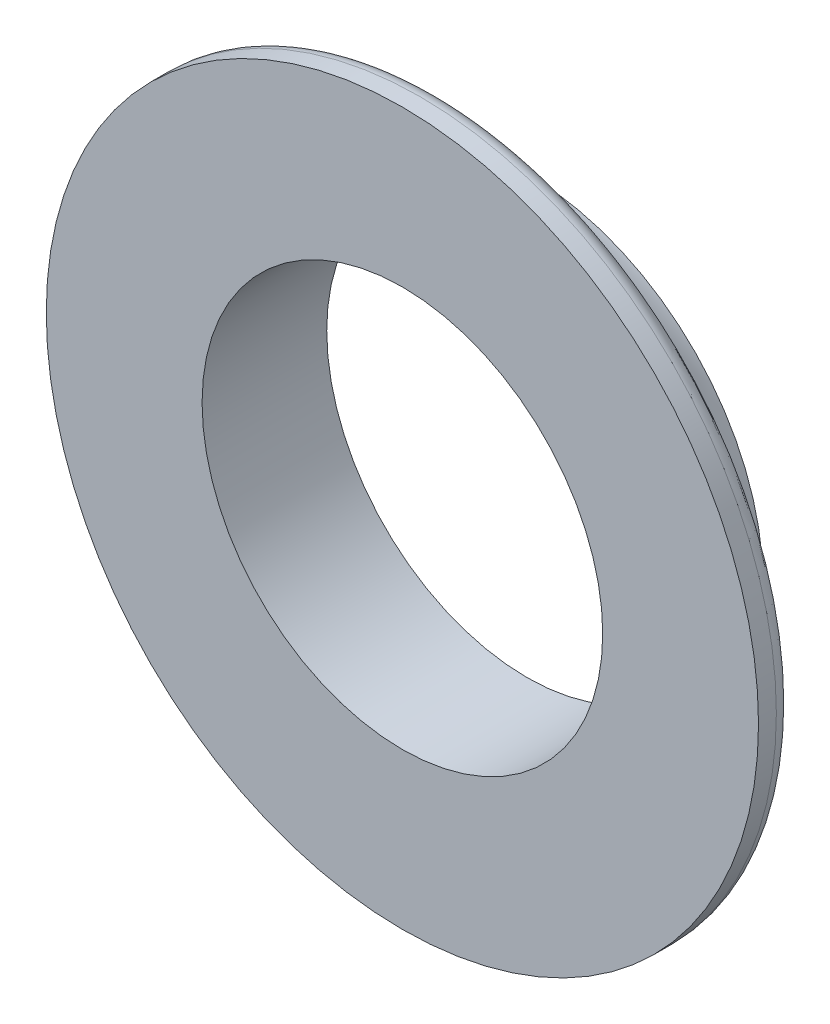
ISO-10303-21;
HEADER;
FILE_DESCRIPTION(('STEP AP214'),'2;1');
FILE_NAME('part.step','',(''),(''),'','','');
FILE_SCHEMA(('AUTOMOTIVE_DESIGN { 1 0 10303 214 1 1 1 1 }'));
ENDSEC;
DATA;
#1=APPLICATION_CONTEXT('core data for automotive mechanical design processes');
#2=APPLICATION_PROTOCOL_DEFINITION('international standard','automotive_design',2000,#1);
#3=PRODUCT_CONTEXT('',#1,'mechanical');
#4=PRODUCT('Part','Part','',(#3));
#5=PRODUCT_RELATED_PRODUCT_CATEGORY('part','',(#4));
#6=PRODUCT_DEFINITION_FORMATION('','',#4);
#7=PRODUCT_DEFINITION_CONTEXT('part definition',#1,'design');
#8=PRODUCT_DEFINITION('design','',#6,#7);
#9=PRODUCT_DEFINITION_SHAPE('','',#8);
#10=(LENGTH_UNIT() NAMED_UNIT(*) SI_UNIT(.MILLI.,.METRE.));
#11=(NAMED_UNIT(*) PLANE_ANGLE_UNIT() SI_UNIT($,.RADIAN.));
#12=(NAMED_UNIT(*) SI_UNIT($,.STERADIAN.) SOLID_ANGLE_UNIT());
#13=UNCERTAINTY_MEASURE_WITH_UNIT(LENGTH_MEASURE(1.E-05),#10,'distance_accuracy_value','');
#14=(GEOMETRIC_REPRESENTATION_CONTEXT(3) GLOBAL_UNCERTAINTY_ASSIGNED_CONTEXT((#13)) GLOBAL_UNIT_ASSIGNED_CONTEXT((#10,
#11,#12)) REPRESENTATION_CONTEXT('',''));
#15=CARTESIAN_POINT('',(0.,0.,0.));
#16=DIRECTION('',(0.,0.,1.));
#17=DIRECTION('',(1.,0.,0.));
#18=AXIS2_PLACEMENT_3D('',#15,#16,#17);
#19=CARTESIAN_POINT('',(0.,0.,7.));
#20=DIRECTION('',(0.,0.,-1.));
#21=DIRECTION('',(-1.,0.,0.));
#22=AXIS2_PLACEMENT_3D('',#19,#20,#21);
#23=CYLINDRICAL_SURFACE('',#22,11.25);
#24=CARTESIAN_POINT('',(0.,0.,0.));
#25=DIRECTION('',(0.,0.,1.));
#26=DIRECTION('',(1.,0.,0.));
#27=AXIS2_PLACEMENT_3D('',#24,#25,#26);
#28=CIRCLE('',#27,11.25);
#29=CARTESIAN_POINT('',(11.25,0.,0.));
#30=VERTEX_POINT('',#29);
#31=EDGE_CURVE('E46',#30,#30,#28,.T.);
#32=ORIENTED_EDGE('',*,*,#31,.F.);
#33=EDGE_LOOP('',(#32));
#34=FACE_BOUND('',#33,.T.);
#35=CARTESIAN_POINT('',(0.,0.,7.));
#36=DIRECTION('',(0.,0.,-1.));
#37=DIRECTION('',(-1.,0.,0.));
#38=AXIS2_PLACEMENT_3D('',#35,#36,#37);
#39=CIRCLE('',#38,11.25);
#40=CARTESIAN_POINT('',(-11.25,0.,7.));
#41=VERTEX_POINT('',#40);
#42=EDGE_CURVE('E54',#41,#41,#39,.T.);
#43=ORIENTED_EDGE('',*,*,#42,.F.);
#44=EDGE_LOOP('',(#43));
#45=FACE_BOUND('',#44,.T.);
#46=ADVANCED_FACE('F31',(#34,#45),#23,.F.);
#47=CARTESIAN_POINT('',(0.,0.,0.));
#48=DIRECTION('',(0.,0.,1.));
#49=DIRECTION('',(1.,0.,0.));
#50=AXIS2_PLACEMENT_3D('',#47,#48,#49);
#51=PLANE('',#50);
#52=CARTESIAN_POINT('',(0.,0.,0.));
#53=DIRECTION('',(0.,0.,1.));
#54=DIRECTION('',(1.,0.,0.));
#55=AXIS2_PLACEMENT_3D('',#52,#53,#54);
#56=CIRCLE('',#55,13.25);
#57=CARTESIAN_POINT('',(13.25,0.,0.));
#58=VERTEX_POINT('',#57);
#59=EDGE_CURVE('E42',#58,#58,#56,.T.);
#60=ORIENTED_EDGE('',*,*,#59,.F.);
#61=EDGE_LOOP('',(#60));
#62=FACE_BOUND('',#61,.T.);
#63=ORIENTED_EDGE('',*,*,#31,.T.);
#64=EDGE_LOOP('',(#63));
#65=FACE_BOUND('',#64,.T.);
#66=ADVANCED_FACE('F62',(#62,#65),#51,.F.);
#67=CARTESIAN_POINT('',(0.,0.,5.));
#68=DIRECTION('',(0.,0.,1.));
#69=DIRECTION('',(1.,0.,0.));
#70=AXIS2_PLACEMENT_3D('',#67,#68,#69);
#71=CYLINDRICAL_SURFACE('',#70,20.);
#72=CARTESIAN_POINT('',(0.,0.,5.99802954449648));
#73=DIRECTION('',(0.,0.,-1.));
#74=DIRECTION('',(-1.,0.,0.));
#75=AXIS2_PLACEMENT_3D('',#72,#73,#74);
#76=CIRCLE('',#75,20.);
#77=CARTESIAN_POINT('',(-20.,0.,5.99802954449648));
#78=VERTEX_POINT('',#77);
#79=EDGE_CURVE('E38',#78,#78,#76,.F.);
#80=ORIENTED_EDGE('',*,*,#79,.T.);
#81=EDGE_LOOP('',(#80));
#82=FACE_BOUND('',#81,.T.);
#83=CARTESIAN_POINT('',(0.,0.,7.));
#84=DIRECTION('',(0.,0.,1.));
#85=DIRECTION('',(1.,0.,0.));
#86=AXIS2_PLACEMENT_3D('',#83,#84,#85);
#87=CIRCLE('',#86,20.);
#88=CARTESIAN_POINT('',(20.,0.,7.));
#89=VERTEX_POINT('',#88);
#90=EDGE_CURVE('E51',#89,#89,#87,.T.);
#91=ORIENTED_EDGE('',*,*,#90,.F.);
#92=EDGE_LOOP('',(#91));
#93=FACE_BOUND('',#92,.T.);
#94=ADVANCED_FACE('F68',(#82,#93),#71,.T.);
#95=CARTESIAN_POINT('',(0.,0.,7.));
#96=DIRECTION('',(0.,0.,1.));
#97=DIRECTION('',(1.,0.,0.));
#98=AXIS2_PLACEMENT_3D('',#95,#96,#97);
#99=PLANE('',#98);
#100=ORIENTED_EDGE('',*,*,#42,.T.);
#101=EDGE_LOOP('',(#100));
#102=FACE_BOUND('',#101,.T.);
#103=ORIENTED_EDGE('',*,*,#90,.T.);
#104=EDGE_LOOP('',(#103));
#105=FACE_BOUND('',#104,.T.);
#106=ADVANCED_FACE('F58',(#102,#105),#99,.T.);
#107=CARTESIAN_POINT('',(0.,0.,-1.));
#108=DIRECTION('',(0.,0.,1.));
#109=DIRECTION('',(1.,0.,0.));
#110=AXIS2_PLACEMENT_3D('',#107,#108,#109);
#111=TOROIDAL_SURFACE('',#110,19.1660797830996,6.);
#112=CARTESIAN_POINT('',(0.,0.,4.99831103812946));
#113=DIRECTION('',(0.,0.,-1.));
#114=DIRECTION('',(-1.,0.,0.));
#115=AXIS2_PLACEMENT_3D('',#112,#113,#114);
#116=CIRCLE('',#115,19.0237256833002);
#117=CARTESIAN_POINT('',(-19.0237256833002,0.,4.99831103812946));
#118=VERTEX_POINT('',#117);
#119=EDGE_CURVE('E10',#118,#118,#116,.T.);
#120=ORIENTED_EDGE('',*,*,#119,.T.);
#121=EDGE_LOOP('',(#120));
#122=FACE_BOUND('',#121,.T.);
#123=ORIENTED_EDGE('',*,*,#59,.T.);
#124=EDGE_LOOP('',(#123));
#125=FACE_BOUND('',#124,.T.);
#126=ADVANCED_FACE('F75',(#122,#125),#111,.F.);
#127=CARTESIAN_POINT('',(0.,0.,5.99802954449648));
#128=DIRECTION('',(0.,0.,-1.));
#129=DIRECTION('',(-1.,0.,0.));
#130=AXIS2_PLACEMENT_3D('',#127,#128,#129);
#131=TOROIDAL_SURFACE('',#130,19.,1.);
#132=ORIENTED_EDGE('',*,*,#119,.F.);
#133=EDGE_LOOP('',(#132));
#134=FACE_BOUND('',#133,.T.);
#135=ORIENTED_EDGE('',*,*,#79,.F.);
#136=EDGE_LOOP('',(#135));
#137=FACE_BOUND('',#136,.T.);
#138=ADVANCED_FACE('F33',(#134,#137),#131,.T.);
#139=CLOSED_SHELL('',(#46,#66,#94,#106,#126,#138));
#140=MANIFOLD_SOLID_BREP('B2',#139);
#141=ADVANCED_BREP_SHAPE_REPRESENTATION('',(#18,#140),#14);
#142=SHAPE_DEFINITION_REPRESENTATION(#9,#141);
ENDSEC;
END-ISO-10303-21;
